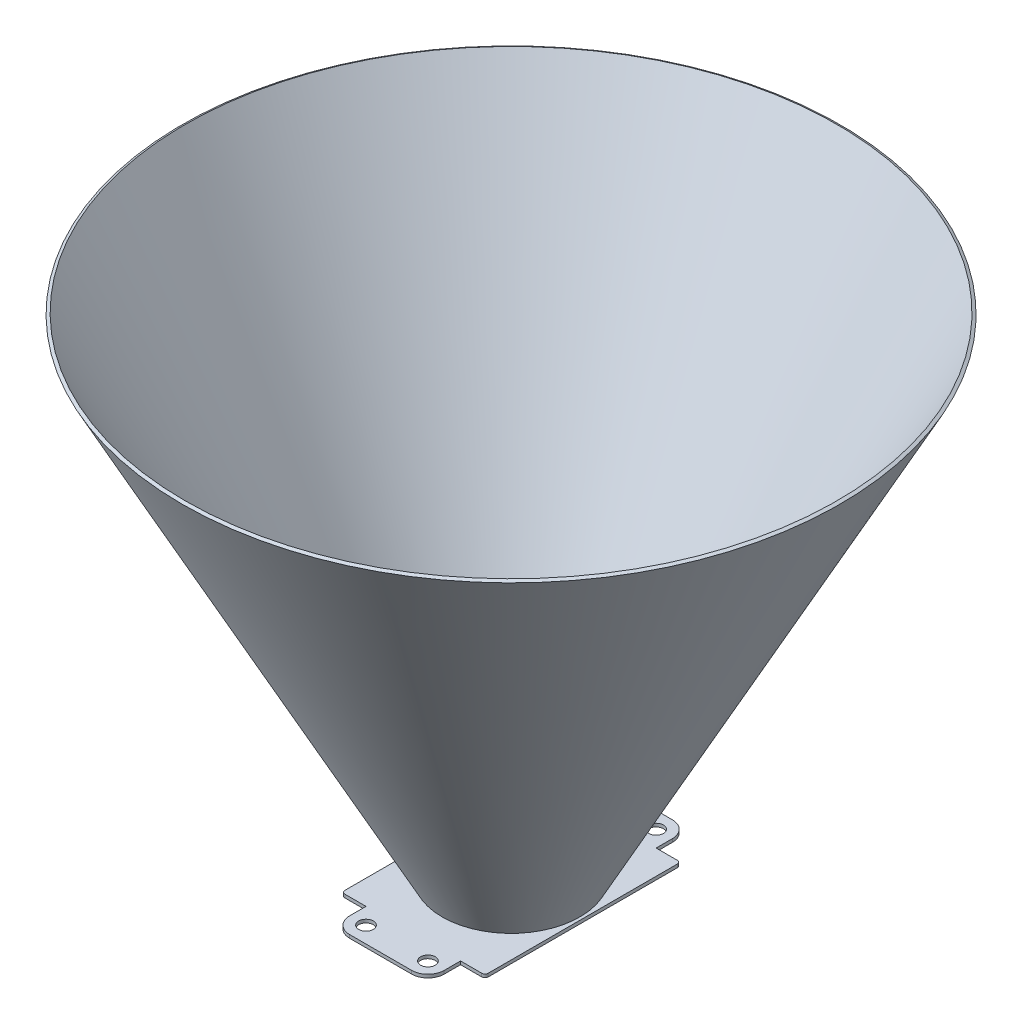
ISO-10303-21;
HEADER;
FILE_DESCRIPTION(('STEP AP214'),'2;1');
FILE_NAME('part.step','',(''),(''),'','','');
FILE_SCHEMA(('AUTOMOTIVE_DESIGN { 1 0 10303 214 1 1 1 1 }'));
ENDSEC;
DATA;
#1=APPLICATION_CONTEXT('core data for automotive mechanical design processes');
#2=APPLICATION_PROTOCOL_DEFINITION('international standard','automotive_design',2000,#1);
#3=PRODUCT_CONTEXT('',#1,'mechanical');
#4=PRODUCT('Part','Part','',(#3));
#5=PRODUCT_RELATED_PRODUCT_CATEGORY('part','',(#4));
#6=PRODUCT_DEFINITION_FORMATION('','',#4);
#7=PRODUCT_DEFINITION_CONTEXT('part definition',#1,'design');
#8=PRODUCT_DEFINITION('design','',#6,#7);
#9=PRODUCT_DEFINITION_SHAPE('','',#8);
#10=(LENGTH_UNIT() NAMED_UNIT(*) SI_UNIT(.MILLI.,.METRE.));
#11=(NAMED_UNIT(*) PLANE_ANGLE_UNIT() SI_UNIT($,.RADIAN.));
#12=(NAMED_UNIT(*) SI_UNIT($,.STERADIAN.) SOLID_ANGLE_UNIT());
#13=UNCERTAINTY_MEASURE_WITH_UNIT(LENGTH_MEASURE(1.E-05),#10,'distance_accuracy_value','');
#14=(GEOMETRIC_REPRESENTATION_CONTEXT(3) GLOBAL_UNCERTAINTY_ASSIGNED_CONTEXT((#13)) GLOBAL_UNIT_ASSIGNED_CONTEXT((#10,
#11,#12)) REPRESENTATION_CONTEXT('',''));
#15=CARTESIAN_POINT('',(0.,0.,0.));
#16=DIRECTION('',(0.,0.,1.));
#17=DIRECTION('',(1.,0.,0.));
#18=AXIS2_PLACEMENT_3D('',#15,#16,#17);
#19=CARTESIAN_POINT('',(-44.,2.,-60.));
#20=DIRECTION('',(0.,0.,1.));
#21=DIRECTION('',(1.,0.,0.));
#22=AXIS2_PLACEMENT_3D('',#19,#20,#21);
#23=PLANE('',#22);
#24=DIRECTION('',(-1.,0.,0.));
#25=VECTOR('',#24,1.);
#26=CARTESIAN_POINT('',(-44.,2.,-60.));
#27=LINE('',#26,#25);
#28=CARTESIAN_POINT('',(42.,2.,-60.));
#29=VERTEX_POINT('',#28);
#30=CARTESIAN_POINT('',(29.,2.,-60.));
#31=VERTEX_POINT('',#30);
#32=EDGE_CURVE('E227',#29,#31,#27,.T.);
#33=ORIENTED_EDGE('',*,*,#32,.F.);
#34=DIRECTION('',(0.,-1.,0.));
#35=VECTOR('',#34,1.);
#36=CARTESIAN_POINT('',(42.,2.,-60.));
#37=LINE('',#36,#35);
#38=CARTESIAN_POINT('',(42.,0.,-60.));
#39=VERTEX_POINT('',#38);
#40=EDGE_CURVE('E342',#29,#39,#37,.T.);
#41=ORIENTED_EDGE('',*,*,#40,.T.);
#42=DIRECTION('',(-1.,0.,0.));
#43=VECTOR('',#42,1.);
#44=CARTESIAN_POINT('',(-44.,0.,-60.));
#45=LINE('',#44,#43);
#46=CARTESIAN_POINT('',(29.,0.,-60.));
#47=VERTEX_POINT('',#46);
#48=EDGE_CURVE('E245',#39,#47,#45,.T.);
#49=ORIENTED_EDGE('',*,*,#48,.T.);
#50=DIRECTION('',(0.,-1.,0.));
#51=VECTOR('',#50,1.);
#52=CARTESIAN_POINT('',(29.,2.,-60.));
#53=LINE('',#52,#51);
#54=EDGE_CURVE('E212',#31,#47,#53,.T.);
#55=ORIENTED_EDGE('',*,*,#54,.F.);
#56=EDGE_LOOP('',(#33,#41,#49,#55));
#57=FACE_BOUND('',#56,.T.);
#58=ADVANCED_FACE('F64',(#57),#23,.F.);
#59=CARTESIAN_POINT('',(-44.,2.,60.));
#60=DIRECTION('',(0.,0.,-1.));
#61=DIRECTION('',(-1.,0.,0.));
#62=AXIS2_PLACEMENT_3D('',#59,#60,#61);
#63=PLANE('',#62);
#64=DIRECTION('',(1.,0.,0.));
#65=VECTOR('',#64,1.);
#66=CARTESIAN_POINT('',(-44.,2.,60.));
#67=LINE('',#66,#65);
#68=CARTESIAN_POINT('',(-42.,2.,60.));
#69=VERTEX_POINT('',#68);
#70=CARTESIAN_POINT('',(-29.,2.,60.));
#71=VERTEX_POINT('',#70);
#72=EDGE_CURVE('E237',#69,#71,#67,.T.);
#73=ORIENTED_EDGE('',*,*,#72,.F.);
#74=DIRECTION('',(0.,-1.,0.));
#75=VECTOR('',#74,1.);
#76=CARTESIAN_POINT('',(-42.,2.,60.));
#77=LINE('',#76,#75);
#78=CARTESIAN_POINT('',(-42.,0.,60.));
#79=VERTEX_POINT('',#78);
#80=EDGE_CURVE('E382',#69,#79,#77,.T.);
#81=ORIENTED_EDGE('',*,*,#80,.T.);
#82=DIRECTION('',(1.,0.,0.));
#83=VECTOR('',#82,1.);
#84=CARTESIAN_POINT('',(-44.,0.,60.));
#85=LINE('',#84,#83);
#86=CARTESIAN_POINT('',(-29.,0.,60.));
#87=VERTEX_POINT('',#86);
#88=EDGE_CURVE('E231',#79,#87,#85,.T.);
#89=ORIENTED_EDGE('',*,*,#88,.T.);
#90=DIRECTION('',(0.,-1.,0.));
#91=VECTOR('',#90,1.);
#92=CARTESIAN_POINT('',(-29.,2.,60.));
#93=LINE('',#92,#91);
#94=EDGE_CURVE('E385',#71,#87,#93,.T.);
#95=ORIENTED_EDGE('',*,*,#94,.F.);
#96=EDGE_LOOP('',(#73,#81,#89,#95));
#97=FACE_BOUND('',#96,.T.);
#98=ADVANCED_FACE('F292',(#97),#63,.F.);
#99=CARTESIAN_POINT('',(44.,2.,-60.));
#100=DIRECTION('',(-1.,0.,0.));
#101=DIRECTION('',(0.,0.,1.));
#102=AXIS2_PLACEMENT_3D('',#99,#100,#101);
#103=PLANE('',#102);
#104=DIRECTION('',(0.,0.,-1.));
#105=VECTOR('',#104,1.);
#106=CARTESIAN_POINT('',(44.,0.,-60.));
#107=LINE('',#106,#105);
#108=CARTESIAN_POINT('',(44.,0.,58.));
#109=VERTEX_POINT('',#108);
#110=CARTESIAN_POINT('',(44.,0.,-58.));
#111=VERTEX_POINT('',#110);
#112=EDGE_CURVE('E240',#109,#111,#107,.T.);
#113=ORIENTED_EDGE('',*,*,#112,.T.);
#114=DIRECTION('',(0.,-1.,0.));
#115=VECTOR('',#114,1.);
#116=CARTESIAN_POINT('',(44.,2.,-58.));
#117=LINE('',#116,#115);
#118=CARTESIAN_POINT('',(44.,2.,-58.));
#119=VERTEX_POINT('',#118);
#120=EDGE_CURVE('E72',#111,#119,#117,.F.);
#121=ORIENTED_EDGE('',*,*,#120,.T.);
#122=DIRECTION('',(0.,0.,-1.));
#123=VECTOR('',#122,1.);
#124=CARTESIAN_POINT('',(44.,2.,-60.));
#125=LINE('',#124,#123);
#126=CARTESIAN_POINT('',(44.,2.,58.));
#127=VERTEX_POINT('',#126);
#128=EDGE_CURVE('E228',#127,#119,#125,.T.);
#129=ORIENTED_EDGE('',*,*,#128,.F.);
#130=DIRECTION('',(0.,-1.,0.));
#131=VECTOR('',#130,1.);
#132=CARTESIAN_POINT('',(44.,2.,58.));
#133=LINE('',#132,#131);
#134=EDGE_CURVE('E349',#127,#109,#133,.T.);
#135=ORIENTED_EDGE('',*,*,#134,.T.);
#136=EDGE_LOOP('',(#113,#121,#129,#135));
#137=FACE_BOUND('',#136,.T.);
#138=ADVANCED_FACE('F298',(#137),#103,.F.);
#139=CARTESIAN_POINT('',(-29.,0.,-60.));
#140=VERTEX_POINT('',#139);
#141=CARTESIAN_POINT('',(-42.,0.,-60.));
#142=VERTEX_POINT('',#141);
#143=EDGE_CURVE('E243',#140,#142,#45,.T.);
#144=ORIENTED_EDGE('',*,*,#143,.T.);
#145=DIRECTION('',(0.,-1.,0.));
#146=VECTOR('',#145,1.);
#147=CARTESIAN_POINT('',(-42.,2.,-60.));
#148=LINE('',#147,#146);
#149=CARTESIAN_POINT('',(-42.,2.,-60.));
#150=VERTEX_POINT('',#149);
#151=EDGE_CURVE('E79',#142,#150,#148,.F.);
#152=ORIENTED_EDGE('',*,*,#151,.T.);
#153=CARTESIAN_POINT('',(-29.,2.,-60.));
#154=VERTEX_POINT('',#153);
#155=EDGE_CURVE('E218',#154,#150,#27,.T.);
#156=ORIENTED_EDGE('',*,*,#155,.F.);
#157=DIRECTION('',(0.,-1.,0.));
#158=VECTOR('',#157,1.);
#159=CARTESIAN_POINT('',(-29.,2.,-60.));
#160=LINE('',#159,#158);
#161=EDGE_CURVE('E203',#154,#140,#160,.T.);
#162=ORIENTED_EDGE('',*,*,#161,.T.);
#163=EDGE_LOOP('',(#144,#152,#156,#162));
#164=FACE_BOUND('',#163,.T.);
#165=ADVANCED_FACE('F226',(#164),#23,.F.);
#166=CARTESIAN_POINT('',(-44.,2.,-60.));
#167=DIRECTION('',(1.,0.,0.));
#168=DIRECTION('',(0.,0.,-1.));
#169=AXIS2_PLACEMENT_3D('',#166,#167,#168);
#170=PLANE('',#169);
#171=DIRECTION('',(0.,0.,1.));
#172=VECTOR('',#171,1.);
#173=CARTESIAN_POINT('',(-44.,0.,-60.));
#174=LINE('',#173,#172);
#175=CARTESIAN_POINT('',(-44.,0.,-58.));
#176=VERTEX_POINT('',#175);
#177=CARTESIAN_POINT('',(-44.,0.,58.));
#178=VERTEX_POINT('',#177);
#179=EDGE_CURVE('E247',#176,#178,#174,.T.);
#180=ORIENTED_EDGE('',*,*,#179,.T.);
#181=DIRECTION('',(0.,-1.,0.));
#182=VECTOR('',#181,1.);
#183=CARTESIAN_POINT('',(-44.,2.,58.));
#184=LINE('',#183,#182);
#185=CARTESIAN_POINT('',(-44.,2.,58.));
#186=VERTEX_POINT('',#185);
#187=EDGE_CURVE('E365',#178,#186,#184,.F.);
#188=ORIENTED_EDGE('',*,*,#187,.T.);
#189=DIRECTION('',(0.,0.,1.));
#190=VECTOR('',#189,1.);
#191=CARTESIAN_POINT('',(-44.,2.,-60.));
#192=LINE('',#191,#190);
#193=CARTESIAN_POINT('',(-44.,2.,-58.));
#194=VERTEX_POINT('',#193);
#195=EDGE_CURVE('E230',#194,#186,#192,.T.);
#196=ORIENTED_EDGE('',*,*,#195,.F.);
#197=DIRECTION('',(0.,-1.,0.));
#198=VECTOR('',#197,1.);
#199=CARTESIAN_POINT('',(-44.,2.,-58.));
#200=LINE('',#199,#198);
#201=EDGE_CURVE('E369',#194,#176,#200,.T.);
#202=ORIENTED_EDGE('',*,*,#201,.T.);
#203=EDGE_LOOP('',(#180,#188,#196,#202));
#204=FACE_BOUND('',#203,.T.);
#205=ADVANCED_FACE('F290',(#204),#170,.F.);
#206=CARTESIAN_POINT('',(29.,0.,60.));
#207=VERTEX_POINT('',#206);
#208=CARTESIAN_POINT('',(42.,0.,60.));
#209=VERTEX_POINT('',#208);
#210=EDGE_CURVE('E250',#207,#209,#85,.T.);
#211=ORIENTED_EDGE('',*,*,#210,.T.);
#212=DIRECTION('',(0.,-1.,0.));
#213=VECTOR('',#212,1.);
#214=CARTESIAN_POINT('',(42.,2.,60.));
#215=LINE('',#214,#213);
#216=CARTESIAN_POINT('',(42.,2.,60.));
#217=VERTEX_POINT('',#216);
#218=EDGE_CURVE('E12',#209,#217,#215,.F.);
#219=ORIENTED_EDGE('',*,*,#218,.T.);
#220=CARTESIAN_POINT('',(29.,2.,60.));
#221=VERTEX_POINT('',#220);
#222=EDGE_CURVE('E236',#221,#217,#67,.T.);
#223=ORIENTED_EDGE('',*,*,#222,.F.);
#224=DIRECTION('',(0.,-1.,0.));
#225=VECTOR('',#224,1.);
#226=CARTESIAN_POINT('',(29.,2.,60.));
#227=LINE('',#226,#225);
#228=EDGE_CURVE('E415',#221,#207,#227,.T.);
#229=ORIENTED_EDGE('',*,*,#228,.T.);
#230=EDGE_LOOP('',(#211,#219,#223,#229));
#231=FACE_BOUND('',#230,.T.);
#232=ADVANCED_FACE('F283',(#231),#63,.F.);
#233=CARTESIAN_POINT('',(0.,2.,0.));
#234=DIRECTION('',(0.,1.,0.));
#235=DIRECTION('',(0.,0.,1.));
#236=AXIS2_PLACEMENT_3D('',#233,#234,#235);
#237=PLANE('',#236);
#238=CARTESIAN_POINT('',(0.,2.,0.));
#239=DIRECTION('',(0.,1.,0.));
#240=DIRECTION('',(0.,0.,1.));
#241=AXIS2_PLACEMENT_3D('',#238,#239,#240);
#242=CIRCLE('',#241,42.2666666666667);
#243=CARTESIAN_POINT('',(0.,2.,42.2666666666667));
#244=VERTEX_POINT('',#243);
#245=EDGE_CURVE('E239',#244,#244,#242,.T.);
#246=ORIENTED_EDGE('',*,*,#245,.F.);
#247=EDGE_LOOP('',(#246));
#248=FACE_BOUND('',#247,.T.);
#249=ORIENTED_EDGE('',*,*,#195,.T.);
#250=CARTESIAN_POINT('',(-42.,2.,58.));
#251=DIRECTION('',(0.,1.,0.));
#252=DIRECTION('',(0.,0.,1.));
#253=AXIS2_PLACEMENT_3D('',#250,#251,#252);
#254=CIRCLE('',#253,2.);
#255=EDGE_CURVE('E353',#186,#69,#254,.T.);
#256=ORIENTED_EDGE('',*,*,#255,.T.);
#257=ORIENTED_EDGE('',*,*,#72,.T.);
#258=DIRECTION('',(0.,0.,-1.));
#259=VECTOR('',#258,1.);
#260=CARTESIAN_POINT('',(-29.,2.,80.));
#261=LINE('',#260,#259);
#262=CARTESIAN_POINT('',(-29.,2.,70.));
#263=VERTEX_POINT('',#262);
#264=EDGE_CURVE('E414',#263,#71,#261,.T.);
#265=ORIENTED_EDGE('',*,*,#264,.F.);
#266=CARTESIAN_POINT('',(-19.,2.,70.));
#267=DIRECTION('',(0.,1.,0.));
#268=DIRECTION('',(0.,0.,1.));
#269=AXIS2_PLACEMENT_3D('',#266,#267,#268);
#270=CIRCLE('',#269,10.);
#271=CARTESIAN_POINT('',(-19.,2.,80.));
#272=VERTEX_POINT('',#271);
#273=EDGE_CURVE('E781',#263,#272,#270,.T.);
#274=ORIENTED_EDGE('',*,*,#273,.T.);
#275=DIRECTION('',(-1.,0.,0.));
#276=VECTOR('',#275,1.);
#277=CARTESIAN_POINT('',(29.,2.,80.));
#278=LINE('',#277,#276);
#279=CARTESIAN_POINT('',(19.,2.,80.));
#280=VERTEX_POINT('',#279);
#281=EDGE_CURVE('E416',#280,#272,#278,.T.);
#282=ORIENTED_EDGE('',*,*,#281,.F.);
#283=CARTESIAN_POINT('',(19.,2.,70.));
#284=DIRECTION('',(0.,1.,0.));
#285=DIRECTION('',(0.,0.,1.));
#286=AXIS2_PLACEMENT_3D('',#283,#284,#285);
#287=CIRCLE('',#286,10.);
#288=CARTESIAN_POINT('',(29.,2.,70.));
#289=VERTEX_POINT('',#288);
#290=EDGE_CURVE('E766',#280,#289,#287,.T.);
#291=ORIENTED_EDGE('',*,*,#290,.T.);
#292=DIRECTION('',(0.,0.,1.));
#293=VECTOR('',#292,1.);
#294=CARTESIAN_POINT('',(29.,2.,60.));
#295=LINE('',#294,#293);
#296=EDGE_CURVE('E422',#221,#289,#295,.T.);
#297=ORIENTED_EDGE('',*,*,#296,.F.);
#298=ORIENTED_EDGE('',*,*,#222,.T.);
#299=CARTESIAN_POINT('',(42.,2.,58.));
#300=DIRECTION('',(0.,1.,0.));
#301=DIRECTION('',(0.,0.,1.));
#302=AXIS2_PLACEMENT_3D('',#299,#300,#301);
#303=CIRCLE('',#302,2.);
#304=EDGE_CURVE('E361',#217,#127,#303,.T.);
#305=ORIENTED_EDGE('',*,*,#304,.T.);
#306=ORIENTED_EDGE('',*,*,#128,.T.);
#307=CARTESIAN_POINT('',(42.,2.,-58.));
#308=DIRECTION('',(0.,1.,0.));
#309=DIRECTION('',(0.,0.,1.));
#310=AXIS2_PLACEMENT_3D('',#307,#308,#309);
#311=CIRCLE('',#310,2.);
#312=EDGE_CURVE('E87',#119,#29,#311,.T.);
#313=ORIENTED_EDGE('',*,*,#312,.T.);
#314=ORIENTED_EDGE('',*,*,#32,.T.);
#315=DIRECTION('',(0.,0.,1.));
#316=VECTOR('',#315,1.);
#317=CARTESIAN_POINT('',(29.,2.,-60.));
#318=LINE('',#317,#316);
#319=CARTESIAN_POINT('',(29.,2.,-70.));
#320=VERTEX_POINT('',#319);
#321=EDGE_CURVE('E213',#320,#31,#318,.T.);
#322=ORIENTED_EDGE('',*,*,#321,.F.);
#323=CARTESIAN_POINT('',(19.,2.,-70.));
#324=DIRECTION('',(0.,1.,0.));
#325=DIRECTION('',(0.,0.,1.));
#326=AXIS2_PLACEMENT_3D('',#323,#324,#325);
#327=CIRCLE('',#326,10.);
#328=CARTESIAN_POINT('',(19.,2.,-80.));
#329=VERTEX_POINT('',#328);
#330=EDGE_CURVE('E778',#320,#329,#327,.T.);
#331=ORIENTED_EDGE('',*,*,#330,.T.);
#332=DIRECTION('',(1.,0.,0.));
#333=VECTOR('',#332,1.);
#334=CARTESIAN_POINT('',(29.,2.,-80.));
#335=LINE('',#334,#333);
#336=CARTESIAN_POINT('',(-19.,2.,-80.));
#337=VERTEX_POINT('',#336);
#338=EDGE_CURVE('E223',#337,#329,#335,.T.);
#339=ORIENTED_EDGE('',*,*,#338,.F.);
#340=CARTESIAN_POINT('',(-19.,2.,-70.));
#341=DIRECTION('',(0.,1.,0.));
#342=DIRECTION('',(0.,0.,1.));
#343=AXIS2_PLACEMENT_3D('',#340,#341,#342);
#344=CIRCLE('',#343,10.);
#345=CARTESIAN_POINT('',(-29.,2.,-70.));
#346=VERTEX_POINT('',#345);
#347=EDGE_CURVE('E222',#337,#346,#344,.T.);
#348=ORIENTED_EDGE('',*,*,#347,.T.);
#349=DIRECTION('',(0.,0.,-1.));
#350=VECTOR('',#349,1.);
#351=CARTESIAN_POINT('',(-29.,2.,-80.));
#352=LINE('',#351,#350);
#353=EDGE_CURVE('E207',#154,#346,#352,.T.);
#354=ORIENTED_EDGE('',*,*,#353,.F.);
#355=ORIENTED_EDGE('',*,*,#155,.T.);
#356=CARTESIAN_POINT('',(-42.,2.,-58.));
#357=DIRECTION('',(0.,1.,0.));
#358=DIRECTION('',(0.,0.,1.));
#359=AXIS2_PLACEMENT_3D('',#356,#357,#358);
#360=CIRCLE('',#359,2.);
#361=EDGE_CURVE('E367',#150,#194,#360,.T.);
#362=ORIENTED_EDGE('',*,*,#361,.T.);
#363=EDGE_LOOP('',(#249,#256,#257,#265,#274,#282,#291,#297,#298,#305,#306,#313,#314,#322,#331,
#339,#348,#354,#355,#362));
#364=FACE_BOUND('',#363,.T.);
#365=CARTESIAN_POINT('',(-19.,2.,70.));
#366=DIRECTION('',(0.,-1.,0.));
#367=DIRECTION('',(0.,0.,1.));
#368=AXIS2_PLACEMENT_3D('',#365,#366,#367);
#369=CIRCLE('',#368,4.50000000000001);
#370=CARTESIAN_POINT('',(-19.,2.,74.5));
#371=VERTEX_POINT('',#370);
#372=EDGE_CURVE('E741',#371,#371,#369,.T.);
#373=ORIENTED_EDGE('',*,*,#372,.T.);
#374=EDGE_LOOP('',(#373));
#375=FACE_BOUND('',#374,.T.);
#376=CARTESIAN_POINT('',(19.,2.,70.));
#377=DIRECTION('',(0.,-1.,0.));
#378=DIRECTION('',(0.,0.,-1.));
#379=AXIS2_PLACEMENT_3D('',#376,#377,#378);
#380=CIRCLE('',#379,4.50000000000001);
#381=CARTESIAN_POINT('',(19.,2.,65.5));
#382=VERTEX_POINT('',#381);
#383=EDGE_CURVE('E411',#382,#382,#380,.T.);
#384=ORIENTED_EDGE('',*,*,#383,.T.);
#385=EDGE_LOOP('',(#384));
#386=FACE_BOUND('',#385,.T.);
#387=CARTESIAN_POINT('',(19.,2.,-70.));
#388=DIRECTION('',(0.,-1.,0.));
#389=DIRECTION('',(0.,0.,1.));
#390=AXIS2_PLACEMENT_3D('',#387,#388,#389);
#391=CIRCLE('',#390,4.50000000000001);
#392=CARTESIAN_POINT('',(19.,2.,-65.5));
#393=VERTEX_POINT('',#392);
#394=EDGE_CURVE('E716',#393,#393,#391,.T.);
#395=ORIENTED_EDGE('',*,*,#394,.T.);
#396=EDGE_LOOP('',(#395));
#397=FACE_BOUND('',#396,.T.);
#398=CARTESIAN_POINT('',(-19.,2.,-70.));
#399=DIRECTION('',(0.,-1.,0.));
#400=DIRECTION('',(0.,0.,-1.));
#401=AXIS2_PLACEMENT_3D('',#398,#399,#400);
#402=CIRCLE('',#401,4.50000000000001);
#403=CARTESIAN_POINT('',(-19.,2.,-74.5));
#404=VERTEX_POINT('',#403);
#405=EDGE_CURVE('E725',#404,#404,#402,.T.);
#406=ORIENTED_EDGE('',*,*,#405,.T.);
#407=EDGE_LOOP('',(#406));
#408=FACE_BOUND('',#407,.T.);
#409=ADVANCED_FACE('F216',(#248,#364,#375,#386,#397,#408),#237,.T.);
#410=CARTESIAN_POINT('',(0.,0.,0.));
#411=DIRECTION('',(0.,1.,0.));
#412=DIRECTION('',(0.,0.,1.));
#413=AXIS2_PLACEMENT_3D('',#410,#411,#412);
#414=PLANE('',#413);
#415=CARTESIAN_POINT('',(0.,0.,0.));
#416=DIRECTION('',(0.,1.,0.));
#417=DIRECTION('',(0.,0.,1.));
#418=AXIS2_PLACEMENT_3D('',#415,#416,#417);
#419=CIRCLE('',#418,40.);
#420=CARTESIAN_POINT('',(0.,0.,40.));
#421=VERTEX_POINT('',#420);
#422=EDGE_CURVE('E244',#421,#421,#419,.T.);
#423=ORIENTED_EDGE('',*,*,#422,.T.);
#424=EDGE_LOOP('',(#423));
#425=FACE_BOUND('',#424,.T.);
#426=ORIENTED_EDGE('',*,*,#88,.F.);
#427=CARTESIAN_POINT('',(-42.,0.,58.));
#428=DIRECTION('',(0.,1.,0.));
#429=DIRECTION('',(0.,0.,1.));
#430=AXIS2_PLACEMENT_3D('',#427,#428,#429);
#431=CIRCLE('',#430,2.);
#432=EDGE_CURVE('E386',#79,#178,#431,.F.);
#433=ORIENTED_EDGE('',*,*,#432,.T.);
#434=ORIENTED_EDGE('',*,*,#179,.F.);
#435=CARTESIAN_POINT('',(-42.,0.,-58.));
#436=DIRECTION('',(0.,1.,0.));
#437=DIRECTION('',(0.,0.,1.));
#438=AXIS2_PLACEMENT_3D('',#435,#436,#437);
#439=CIRCLE('',#438,2.);
#440=EDGE_CURVE('E396',#176,#142,#439,.F.);
#441=ORIENTED_EDGE('',*,*,#440,.T.);
#442=ORIENTED_EDGE('',*,*,#143,.F.);
#443=DIRECTION('',(0.,0.,-1.));
#444=VECTOR('',#443,1.);
#445=CARTESIAN_POINT('',(-29.,0.,-80.));
#446=LINE('',#445,#444);
#447=CARTESIAN_POINT('',(-29.,0.,-70.));
#448=VERTEX_POINT('',#447);
#449=EDGE_CURVE('E210',#140,#448,#446,.T.);
#450=ORIENTED_EDGE('',*,*,#449,.T.);
#451=CARTESIAN_POINT('',(-19.,0.,-70.));
#452=DIRECTION('',(0.,1.,0.));
#453=DIRECTION('',(0.,0.,1.));
#454=AXIS2_PLACEMENT_3D('',#451,#452,#453);
#455=CIRCLE('',#454,10.);
#456=CARTESIAN_POINT('',(-19.,0.,-80.));
#457=VERTEX_POINT('',#456);
#458=EDGE_CURVE('E767',#448,#457,#455,.F.);
#459=ORIENTED_EDGE('',*,*,#458,.T.);
#460=DIRECTION('',(1.,0.,0.));
#461=VECTOR('',#460,1.);
#462=CARTESIAN_POINT('',(29.,0.,-80.));
#463=LINE('',#462,#461);
#464=CARTESIAN_POINT('',(19.,0.,-80.));
#465=VERTEX_POINT('',#464);
#466=EDGE_CURVE('E734',#457,#465,#463,.T.);
#467=ORIENTED_EDGE('',*,*,#466,.T.);
#468=CARTESIAN_POINT('',(19.,0.,-70.));
#469=DIRECTION('',(0.,1.,0.));
#470=DIRECTION('',(0.,0.,1.));
#471=AXIS2_PLACEMENT_3D('',#468,#469,#470);
#472=CIRCLE('',#471,10.);
#473=CARTESIAN_POINT('',(29.,0.,-70.));
#474=VERTEX_POINT('',#473);
#475=EDGE_CURVE('E771',#465,#474,#472,.F.);
#476=ORIENTED_EDGE('',*,*,#475,.T.);
#477=DIRECTION('',(0.,0.,1.));
#478=VECTOR('',#477,1.);
#479=CARTESIAN_POINT('',(29.,0.,-60.));
#480=LINE('',#479,#478);
#481=EDGE_CURVE('E224',#474,#47,#480,.T.);
#482=ORIENTED_EDGE('',*,*,#481,.T.);
#483=ORIENTED_EDGE('',*,*,#48,.F.);
#484=CARTESIAN_POINT('',(42.,0.,-58.));
#485=DIRECTION('',(0.,1.,0.));
#486=DIRECTION('',(0.,0.,1.));
#487=AXIS2_PLACEMENT_3D('',#484,#485,#486);
#488=CIRCLE('',#487,2.);
#489=EDGE_CURVE('E348',#39,#111,#488,.F.);
#490=ORIENTED_EDGE('',*,*,#489,.T.);
#491=ORIENTED_EDGE('',*,*,#112,.F.);
#492=CARTESIAN_POINT('',(42.,0.,58.));
#493=DIRECTION('',(0.,1.,0.));
#494=DIRECTION('',(0.,0.,1.));
#495=AXIS2_PLACEMENT_3D('',#492,#493,#494);
#496=CIRCLE('',#495,2.);
#497=EDGE_CURVE('E387',#109,#209,#496,.F.);
#498=ORIENTED_EDGE('',*,*,#497,.T.);
#499=ORIENTED_EDGE('',*,*,#210,.F.);
#500=DIRECTION('',(0.,0.,1.));
#501=VECTOR('',#500,1.);
#502=CARTESIAN_POINT('',(29.,0.,60.));
#503=LINE('',#502,#501);
#504=CARTESIAN_POINT('',(29.,0.,70.));
#505=VERTEX_POINT('',#504);
#506=EDGE_CURVE('E410',#207,#505,#503,.T.);
#507=ORIENTED_EDGE('',*,*,#506,.T.);
#508=CARTESIAN_POINT('',(19.,0.,70.));
#509=DIRECTION('',(0.,1.,0.));
#510=DIRECTION('',(0.,0.,1.));
#511=AXIS2_PLACEMENT_3D('',#508,#509,#510);
#512=CIRCLE('',#511,10.);
#513=CARTESIAN_POINT('',(19.,0.,80.));
#514=VERTEX_POINT('',#513);
#515=EDGE_CURVE('E757',#505,#514,#512,.F.);
#516=ORIENTED_EDGE('',*,*,#515,.T.);
#517=DIRECTION('',(-1.,0.,0.));
#518=VECTOR('',#517,1.);
#519=CARTESIAN_POINT('',(29.,0.,80.));
#520=LINE('',#519,#518);
#521=CARTESIAN_POINT('',(-19.,0.,80.));
#522=VERTEX_POINT('',#521);
#523=EDGE_CURVE('E752',#514,#522,#520,.T.);
#524=ORIENTED_EDGE('',*,*,#523,.T.);
#525=CARTESIAN_POINT('',(-19.,0.,70.));
#526=DIRECTION('',(0.,1.,0.));
#527=DIRECTION('',(0.,0.,1.));
#528=AXIS2_PLACEMENT_3D('',#525,#526,#527);
#529=CIRCLE('',#528,10.);
#530=CARTESIAN_POINT('',(-29.,0.,70.));
#531=VERTEX_POINT('',#530);
#532=EDGE_CURVE('E407',#522,#531,#529,.F.);
#533=ORIENTED_EDGE('',*,*,#532,.T.);
#534=DIRECTION('',(0.,0.,-1.));
#535=VECTOR('',#534,1.);
#536=CARTESIAN_POINT('',(-29.,0.,80.));
#537=LINE('',#536,#535);
#538=EDGE_CURVE('E405',#531,#87,#537,.T.);
#539=ORIENTED_EDGE('',*,*,#538,.T.);
#540=EDGE_LOOP('',(#426,#433,#434,#441,#442,#450,#459,#467,#476,#482,#483,#490,#491,#498,#499,
#507,#516,#524,#533,#539));
#541=FACE_BOUND('',#540,.T.);
#542=CARTESIAN_POINT('',(-19.,0.,70.));
#543=DIRECTION('',(0.,-1.,0.));
#544=DIRECTION('',(0.,0.,1.));
#545=AXIS2_PLACEMENT_3D('',#542,#543,#544);
#546=CIRCLE('',#545,4.50000000000001);
#547=CARTESIAN_POINT('',(-19.,0.,74.5));
#548=VERTEX_POINT('',#547);
#549=EDGE_CURVE('E739',#548,#548,#546,.T.);
#550=ORIENTED_EDGE('',*,*,#549,.F.);
#551=EDGE_LOOP('',(#550));
#552=FACE_BOUND('',#551,.T.);
#553=CARTESIAN_POINT('',(19.,0.,70.));
#554=DIRECTION('',(0.,-1.,0.));
#555=DIRECTION('',(0.,0.,-1.));
#556=AXIS2_PLACEMENT_3D('',#553,#554,#555);
#557=CIRCLE('',#556,4.50000000000001);
#558=CARTESIAN_POINT('',(19.,0.,65.5));
#559=VERTEX_POINT('',#558);
#560=EDGE_CURVE('E744',#559,#559,#557,.T.);
#561=ORIENTED_EDGE('',*,*,#560,.F.);
#562=EDGE_LOOP('',(#561));
#563=FACE_BOUND('',#562,.T.);
#564=CARTESIAN_POINT('',(19.,0.,-70.));
#565=DIRECTION('',(0.,-1.,0.));
#566=DIRECTION('',(0.,0.,1.));
#567=AXIS2_PLACEMENT_3D('',#564,#565,#566);
#568=CIRCLE('',#567,4.50000000000001);
#569=CARTESIAN_POINT('',(19.,0.,-65.5));
#570=VERTEX_POINT('',#569);
#571=EDGE_CURVE('E719',#570,#570,#568,.T.);
#572=ORIENTED_EDGE('',*,*,#571,.F.);
#573=EDGE_LOOP('',(#572));
#574=FACE_BOUND('',#573,.T.);
#575=CARTESIAN_POINT('',(-19.,0.,-70.));
#576=DIRECTION('',(0.,-1.,0.));
#577=DIRECTION('',(0.,0.,-1.));
#578=AXIS2_PLACEMENT_3D('',#575,#576,#577);
#579=CIRCLE('',#578,4.50000000000001);
#580=CARTESIAN_POINT('',(-19.,0.,-74.5));
#581=VERTEX_POINT('',#580);
#582=EDGE_CURVE('E722',#581,#581,#579,.T.);
#583=ORIENTED_EDGE('',*,*,#582,.F.);
#584=EDGE_LOOP('',(#583));
#585=FACE_BOUND('',#584,.T.);
#586=ADVANCED_FACE('F277',(#425,#541,#552,#563,#574,#585),#414,.F.);
#587=CARTESIAN_POINT('',(0.,0.,0.));
#588=DIRECTION('',(0.,1.,0.));
#589=DIRECTION('',(0.,0.,1.));
#590=AXIS2_PLACEMENT_3D('',#587,#588,#589);
#591=CYLINDRICAL_SURFACE('',#590,40.);
#592=ORIENTED_EDGE('',*,*,#422,.F.);
#593=EDGE_LOOP('',(#592));
#594=FACE_BOUND('',#593,.T.);
#595=CARTESIAN_POINT('',(0.,2.,0.));
#596=DIRECTION('',(0.,1.,0.));
#597=DIRECTION('',(0.,0.,1.));
#598=AXIS2_PLACEMENT_3D('',#595,#596,#597);
#599=CIRCLE('',#598,40.);
#600=CARTESIAN_POINT('',(0.,2.,40.));
#601=VERTEX_POINT('',#600);
#602=EDGE_CURVE('E259',#601,#601,#599,.T.);
#603=ORIENTED_EDGE('',*,*,#602,.T.);
#604=EDGE_LOOP('',(#603));
#605=FACE_BOUND('',#604,.T.);
#606=ADVANCED_FACE('F266',(#594,#605),#591,.F.);
#607=CARTESIAN_POINT('',(0.,302.,0.));
#608=DIRECTION('',(0.,-1.,0.));
#609=DIRECTION('',(0.,0.,-1.));
#610=AXIS2_PLACEMENT_3D('',#607,#608,#609);
#611=CONICAL_SURFACE('',#610,200.,1.08083900054117);
#612=CARTESIAN_POINT('',(0.,301.058823529412,0.));
#613=DIRECTION('',(0.,1.,0.));
#614=DIRECTION('',(0.56359204964654,0.,-0.826053268001048));
#615=AXIS2_PLACEMENT_3D('',#612,#613,#614);
#616=CIRCLE('',#615,201.764705882353);
#617=CARTESIAN_POINT('',(113.712984134567,301.058823529412,-166.668394661388));
#618=VERTEX_POINT('',#617);
#619=EDGE_CURVE('E430',#618,#618,#616,.T.);
#620=ORIENTED_EDGE('',*,*,#619,.T.);
#621=EDGE_LOOP('',(#620));
#622=FACE_BOUND('',#621,.T.);
#623=CARTESIAN_POINT('',(0.,302.,0.));
#624=DIRECTION('',(0.,1.,0.));
#625=DIRECTION('',(0.,0.,1.));
#626=AXIS2_PLACEMENT_3D('',#623,#624,#625);
#627=CIRCLE('',#626,200.);
#628=CARTESIAN_POINT('',(0.,302.,200.));
#629=VERTEX_POINT('',#628);
#630=EDGE_CURVE('E419',#629,#629,#627,.T.);
#631=ORIENTED_EDGE('',*,*,#630,.F.);
#632=EDGE_LOOP('',(#631));
#633=FACE_BOUND('',#632,.T.);
#634=ADVANCED_FACE('F276',(#622,#633),#611,.T.);
#635=CARTESIAN_POINT('',(0.,1.05882352941176,0.));
#636=DIRECTION('',(0.,1.,0.));
#637=DIRECTION('',(0.,0.,1.));
#638=AXIS2_PLACEMENT_3D('',#635,#636,#637);
#639=CONICAL_SURFACE('',#638,41.7647058823529,0.489957326253728);
#640=ORIENTED_EDGE('',*,*,#245,.T.);
#641=EDGE_LOOP('',(#640));
#642=FACE_BOUND('',#641,.T.);
#643=ORIENTED_EDGE('',*,*,#619,.F.);
#644=EDGE_LOOP('',(#643));
#645=FACE_BOUND('',#644,.T.);
#646=ADVANCED_FACE('F436',(#642,#645),#639,.T.);
#647=CARTESIAN_POINT('',(0.,2.,0.));
#648=DIRECTION('',(0.,1.,0.));
#649=DIRECTION('',(0.,0.,1.));
#650=AXIS2_PLACEMENT_3D('',#647,#648,#649);
#651=CONICAL_SURFACE('',#650,40.,0.489957326253728);
#652=CARTESIAN_POINT('',(0.,2.,40.));
#653=CARTESIAN_POINT('',(0.,5.125,41.6666666666667));
#654=CARTESIAN_POINT('',(0.,8.25,43.3333333333333));
#655=CARTESIAN_POINT('',(0.,14.5,46.6666666666667));
#656=CARTESIAN_POINT('',(0.,17.625,48.3333333333333));
#657=CARTESIAN_POINT('',(0.,23.875,51.6666666666667));
#658=CARTESIAN_POINT('',(0.,27.,53.3333333333333));
#659=CARTESIAN_POINT('',(0.,33.25,56.6666666666667));
#660=CARTESIAN_POINT('',(0.,36.375,58.3333333333333));
#661=CARTESIAN_POINT('',(0.,42.625,61.6666666666667));
#662=CARTESIAN_POINT('',(0.,45.75,63.3333333333333));
#663=CARTESIAN_POINT('',(0.,52.,66.6666666666667));
#664=CARTESIAN_POINT('',(0.,55.125,68.3333333333333));
#665=CARTESIAN_POINT('',(0.,61.375,71.6666666666667));
#666=CARTESIAN_POINT('',(0.,64.5,73.3333333333333));
#667=CARTESIAN_POINT('',(0.,70.75,76.6666666666667));
#668=CARTESIAN_POINT('',(0.,73.875,78.3333333333333));
#669=CARTESIAN_POINT('',(0.,80.125,81.6666666666667));
#670=CARTESIAN_POINT('',(0.,83.25,83.3333333333333));
#671=CARTESIAN_POINT('',(0.,89.5,86.6666666666667));
#672=CARTESIAN_POINT('',(0.,92.625,88.3333333333333));
#673=CARTESIAN_POINT('',(0.,98.875,91.6666666666666));
#674=CARTESIAN_POINT('',(0.,102.,93.3333333333333));
#675=CARTESIAN_POINT('',(0.,108.25,96.6666666666667));
#676=CARTESIAN_POINT('',(0.,111.375,98.3333333333333));
#677=CARTESIAN_POINT('',(0.,117.625,101.666666666667));
#678=CARTESIAN_POINT('',(0.,120.75,103.333333333333));
#679=CARTESIAN_POINT('',(0.,127.,106.666666666667));
#680=CARTESIAN_POINT('',(0.,130.125,108.333333333333));
#681=CARTESIAN_POINT('',(0.,136.375,111.666666666667));
#682=CARTESIAN_POINT('',(0.,139.5,113.333333333333));
#683=CARTESIAN_POINT('',(0.,145.75,116.666666666667));
#684=CARTESIAN_POINT('',(0.,148.875,118.333333333333));
#685=CARTESIAN_POINT('',(0.,155.125,121.666666666667));
#686=CARTESIAN_POINT('',(0.,158.25,123.333333333333));
#687=CARTESIAN_POINT('',(0.,164.5,126.666666666667));
#688=CARTESIAN_POINT('',(0.,167.625,128.333333333333));
#689=CARTESIAN_POINT('',(0.,173.875,131.666666666667));
#690=CARTESIAN_POINT('',(0.,177.,133.333333333333));
#691=CARTESIAN_POINT('',(0.,183.25,136.666666666667));
#692=CARTESIAN_POINT('',(0.,186.375,138.333333333333));
#693=CARTESIAN_POINT('',(0.,192.625,141.666666666667));
#694=CARTESIAN_POINT('',(0.,195.75,143.333333333333));
#695=CARTESIAN_POINT('',(0.,202.,146.666666666667));
#696=CARTESIAN_POINT('',(0.,205.125,148.333333333333));
#697=CARTESIAN_POINT('',(0.,211.375,151.666666666667));
#698=CARTESIAN_POINT('',(0.,214.5,153.333333333333));
#699=CARTESIAN_POINT('',(0.,220.75,156.666666666667));
#700=CARTESIAN_POINT('',(0.,223.875,158.333333333333));
#701=CARTESIAN_POINT('',(0.,230.125,161.666666666667));
#702=CARTESIAN_POINT('',(0.,233.25,163.333333333333));
#703=CARTESIAN_POINT('',(0.,239.5,166.666666666667));
#704=CARTESIAN_POINT('',(0.,242.625,168.333333333333));
#705=CARTESIAN_POINT('',(0.,248.875,171.666666666667));
#706=CARTESIAN_POINT('',(0.,252.,173.333333333333));
#707=CARTESIAN_POINT('',(0.,258.25,176.666666666667));
#708=CARTESIAN_POINT('',(0.,261.375,178.333333333333));
#709=CARTESIAN_POINT('',(0.,267.625,181.666666666667));
#710=CARTESIAN_POINT('',(0.,270.75,183.333333333333));
#711=CARTESIAN_POINT('',(0.,277.,186.666666666667));
#712=CARTESIAN_POINT('',(0.,280.125,188.333333333333));
#713=CARTESIAN_POINT('',(0.,286.375,191.666666666667));
#714=CARTESIAN_POINT('',(0.,289.5,193.333333333333));
#715=CARTESIAN_POINT('',(0.,295.75,196.666666666667));
#716=CARTESIAN_POINT('',(0.,298.875,198.333333333333));
#717=CARTESIAN_POINT('',(0.,302.,200.));
#718=B_SPLINE_CURVE_WITH_KNOTS('',3,(#652,#653,#654,#655,#656,#657,#658,#659,#660,#661,#662,
#663,#664,#665,#666,#667,#668,#669,#670,#671,#672,#673,#674,#675,#676,#677,#678,#679,#680,#681,
#682,#683,#684,#685,#686,#687,#688,#689,#690,#691,#692,#693,#694,#695,#696,#697,#698,#699,#700,
#701,#702,#703,#704,#705,#706,#707,#708,#709,#710,#711,#712,#713,#714,#715,#716,#717),
.UNSPECIFIED.,.F.,.F.,(4,2,2,2,2,2,2,2,2,2,2,2,2,2,2,2,2,2,2,2,2,2,2,2,2,2,2,2,2,2,2,2,4),(0.,
10.625,21.25,31.875,42.5,53.125,63.75,74.375,85.,95.625,106.25,116.875,127.5,138.125,148.75,
159.375,170.,180.625,191.25,201.875,212.5,223.125,233.75,244.375,255.,265.625,276.25,286.875,
297.5,308.125,318.75,329.375,340.),.UNSPECIFIED.);
#719=EDGE_CURVE('BSEAM445',#601,#629,#718,.T.);
#720=ORIENTED_EDGE('',*,*,#602,.F.);
#721=ORIENTED_EDGE('',*,*,#630,.T.);
#722=ORIENTED_EDGE('',*,*,#719,.T.);
#723=ORIENTED_EDGE('',*,*,#719,.F.);
#724=EDGE_LOOP('',(#720,#722,#721,#723));
#725=FACE_BOUND('',#724,.T.);
#726=ADVANCED_FACE('F445',(#725),#651,.F.);
#727=CARTESIAN_POINT('',(-29.,2.,80.));
#728=DIRECTION('',(-1.,0.,0.));
#729=DIRECTION('',(0.,0.,1.));
#730=AXIS2_PLACEMENT_3D('',#727,#728,#729);
#731=PLANE('',#730);
#732=ORIENTED_EDGE('',*,*,#538,.F.);
#733=DIRECTION('',(0.,-1.,0.));
#734=VECTOR('',#733,1.);
#735=CARTESIAN_POINT('',(-29.,2.,70.));
#736=LINE('',#735,#734);
#737=EDGE_CURVE('E775',#531,#263,#736,.F.);
#738=ORIENTED_EDGE('',*,*,#737,.T.);
#739=ORIENTED_EDGE('',*,*,#264,.T.);
#740=ORIENTED_EDGE('',*,*,#94,.T.);
#741=EDGE_LOOP('',(#732,#738,#739,#740));
#742=FACE_BOUND('',#741,.T.);
#743=ADVANCED_FACE('F413',(#742),#731,.T.);
#744=CARTESIAN_POINT('',(29.,2.,80.));
#745=DIRECTION('',(0.,0.,1.));
#746=DIRECTION('',(1.,0.,0.));
#747=AXIS2_PLACEMENT_3D('',#744,#745,#746);
#748=PLANE('',#747);
#749=ORIENTED_EDGE('',*,*,#281,.T.);
#750=DIRECTION('',(0.,-1.,0.));
#751=VECTOR('',#750,1.);
#752=CARTESIAN_POINT('',(-19.,2.,80.));
#753=LINE('',#752,#751);
#754=EDGE_CURVE('E762',#272,#522,#753,.T.);
#755=ORIENTED_EDGE('',*,*,#754,.T.);
#756=ORIENTED_EDGE('',*,*,#523,.F.);
#757=DIRECTION('',(0.,-1.,0.));
#758=VECTOR('',#757,1.);
#759=CARTESIAN_POINT('',(19.,2.,80.));
#760=LINE('',#759,#758);
#761=EDGE_CURVE('E254',#514,#280,#760,.F.);
#762=ORIENTED_EDGE('',*,*,#761,.T.);
#763=EDGE_LOOP('',(#749,#755,#756,#762));
#764=FACE_BOUND('',#763,.T.);
#765=ADVANCED_FACE('F511',(#764),#748,.T.);
#766=CARTESIAN_POINT('',(29.,2.,60.));
#767=DIRECTION('',(1.,0.,0.));
#768=DIRECTION('',(0.,0.,-1.));
#769=AXIS2_PLACEMENT_3D('',#766,#767,#768);
#770=PLANE('',#769);
#771=ORIENTED_EDGE('',*,*,#296,.T.);
#772=DIRECTION('',(0.,-1.,0.));
#773=VECTOR('',#772,1.);
#774=CARTESIAN_POINT('',(29.,2.,70.));
#775=LINE('',#774,#773);
#776=EDGE_CURVE('E783',#289,#505,#775,.T.);
#777=ORIENTED_EDGE('',*,*,#776,.T.);
#778=ORIENTED_EDGE('',*,*,#506,.F.);
#779=ORIENTED_EDGE('',*,*,#228,.F.);
#780=EDGE_LOOP('',(#771,#777,#778,#779));
#781=FACE_BOUND('',#780,.T.);
#782=ADVANCED_FACE('F518',(#781),#770,.T.);
#783=CARTESIAN_POINT('',(19.,2.,70.));
#784=DIRECTION('',(0.,-1.,0.));
#785=DIRECTION('',(0.,0.,-1.));
#786=AXIS2_PLACEMENT_3D('',#783,#784,#785);
#787=CYLINDRICAL_SURFACE('',#786,4.50000000000001);
#788=ORIENTED_EDGE('',*,*,#383,.F.);
#789=EDGE_LOOP('',(#788));
#790=FACE_BOUND('',#789,.T.);
#791=ORIENTED_EDGE('',*,*,#560,.T.);
#792=EDGE_LOOP('',(#791));
#793=FACE_BOUND('',#792,.T.);
#794=ADVANCED_FACE('F526',(#790,#793),#787,.F.);
#795=CARTESIAN_POINT('',(-19.,2.,70.));
#796=DIRECTION('',(0.,-1.,0.));
#797=DIRECTION('',(0.,0.,-1.));
#798=AXIS2_PLACEMENT_3D('',#795,#796,#797);
#799=CYLINDRICAL_SURFACE('',#798,4.50000000000001);
#800=ORIENTED_EDGE('',*,*,#372,.F.);
#801=EDGE_LOOP('',(#800));
#802=FACE_BOUND('',#801,.T.);
#803=ORIENTED_EDGE('',*,*,#549,.T.);
#804=EDGE_LOOP('',(#803));
#805=FACE_BOUND('',#804,.T.);
#806=ADVANCED_FACE('F533',(#802,#805),#799,.F.);
#807=CARTESIAN_POINT('',(29.,2.,-60.));
#808=DIRECTION('',(1.,0.,0.));
#809=DIRECTION('',(0.,0.,-1.));
#810=AXIS2_PLACEMENT_3D('',#807,#808,#809);
#811=PLANE('',#810);
#812=ORIENTED_EDGE('',*,*,#481,.F.);
#813=DIRECTION('',(0.,-1.,0.));
#814=VECTOR('',#813,1.);
#815=CARTESIAN_POINT('',(29.,2.,-70.));
#816=LINE('',#815,#814);
#817=EDGE_CURVE('E391',#474,#320,#816,.F.);
#818=ORIENTED_EDGE('',*,*,#817,.T.);
#819=ORIENTED_EDGE('',*,*,#321,.T.);
#820=ORIENTED_EDGE('',*,*,#54,.T.);
#821=EDGE_LOOP('',(#812,#818,#819,#820));
#822=FACE_BOUND('',#821,.T.);
#823=ADVANCED_FACE('F541',(#822),#811,.T.);
#824=CARTESIAN_POINT('',(29.,2.,-80.));
#825=DIRECTION('',(0.,0.,-1.));
#826=DIRECTION('',(-1.,0.,0.));
#827=AXIS2_PLACEMENT_3D('',#824,#825,#826);
#828=PLANE('',#827);
#829=ORIENTED_EDGE('',*,*,#338,.T.);
#830=DIRECTION('',(0.,-1.,0.));
#831=VECTOR('',#830,1.);
#832=CARTESIAN_POINT('',(19.,2.,-80.));
#833=LINE('',#832,#831);
#834=EDGE_CURVE('E787',#329,#465,#833,.T.);
#835=ORIENTED_EDGE('',*,*,#834,.T.);
#836=ORIENTED_EDGE('',*,*,#466,.F.);
#837=DIRECTION('',(0.,-1.,0.));
#838=VECTOR('',#837,1.);
#839=CARTESIAN_POINT('',(-19.,2.,-80.));
#840=LINE('',#839,#838);
#841=EDGE_CURVE('E785',#457,#337,#840,.F.);
#842=ORIENTED_EDGE('',*,*,#841,.T.);
#843=EDGE_LOOP('',(#829,#835,#836,#842));
#844=FACE_BOUND('',#843,.T.);
#845=ADVANCED_FACE('F549',(#844),#828,.T.);
#846=CARTESIAN_POINT('',(-29.,2.,-80.));
#847=DIRECTION('',(-1.,0.,0.));
#848=DIRECTION('',(0.,0.,1.));
#849=AXIS2_PLACEMENT_3D('',#846,#847,#848);
#850=PLANE('',#849);
#851=ORIENTED_EDGE('',*,*,#353,.T.);
#852=DIRECTION('',(0.,-1.,0.));
#853=VECTOR('',#852,1.);
#854=CARTESIAN_POINT('',(-29.,2.,-70.));
#855=LINE('',#854,#853);
#856=EDGE_CURVE('E388',#346,#448,#855,.T.);
#857=ORIENTED_EDGE('',*,*,#856,.T.);
#858=ORIENTED_EDGE('',*,*,#449,.F.);
#859=ORIENTED_EDGE('',*,*,#161,.F.);
#860=EDGE_LOOP('',(#851,#857,#858,#859));
#861=FACE_BOUND('',#860,.T.);
#862=ADVANCED_FACE('F205',(#861),#850,.T.);
#863=CARTESIAN_POINT('',(-19.,2.,-70.));
#864=DIRECTION('',(0.,-1.,0.));
#865=DIRECTION('',(0.,0.,-1.));
#866=AXIS2_PLACEMENT_3D('',#863,#864,#865);
#867=CYLINDRICAL_SURFACE('',#866,4.50000000000001);
#868=ORIENTED_EDGE('',*,*,#405,.F.);
#869=EDGE_LOOP('',(#868));
#870=FACE_BOUND('',#869,.T.);
#871=ORIENTED_EDGE('',*,*,#582,.T.);
#872=EDGE_LOOP('',(#871));
#873=FACE_BOUND('',#872,.T.);
#874=ADVANCED_FACE('F564',(#870,#873),#867,.F.);
#875=CARTESIAN_POINT('',(19.,2.,-70.));
#876=DIRECTION('',(0.,-1.,0.));
#877=DIRECTION('',(0.,0.,-1.));
#878=AXIS2_PLACEMENT_3D('',#875,#876,#877);
#879=CYLINDRICAL_SURFACE('',#878,4.50000000000001);
#880=ORIENTED_EDGE('',*,*,#394,.F.);
#881=EDGE_LOOP('',(#880));
#882=FACE_BOUND('',#881,.T.);
#883=ORIENTED_EDGE('',*,*,#571,.T.);
#884=EDGE_LOOP('',(#883));
#885=FACE_BOUND('',#884,.T.);
#886=ADVANCED_FACE('F306',(#882,#885),#879,.F.);
#887=CARTESIAN_POINT('',(-19.,2.,70.));
#888=DIRECTION('',(0.,-1.,0.));
#889=DIRECTION('',(0.,0.,-1.));
#890=AXIS2_PLACEMENT_3D('',#887,#888,#889);
#891=CYLINDRICAL_SURFACE('',#890,10.);
#892=ORIENTED_EDGE('',*,*,#273,.F.);
#893=ORIENTED_EDGE('',*,*,#737,.F.);
#894=ORIENTED_EDGE('',*,*,#532,.F.);
#895=ORIENTED_EDGE('',*,*,#754,.F.);
#896=EDGE_LOOP('',(#892,#893,#894,#895));
#897=FACE_BOUND('',#896,.T.);
#898=ADVANCED_FACE('F302',(#897),#891,.T.);
#899=CARTESIAN_POINT('',(19.,2.,70.));
#900=DIRECTION('',(0.,-1.,0.));
#901=DIRECTION('',(0.,0.,-1.));
#902=AXIS2_PLACEMENT_3D('',#899,#900,#901);
#903=CYLINDRICAL_SURFACE('',#902,10.);
#904=ORIENTED_EDGE('',*,*,#290,.F.);
#905=ORIENTED_EDGE('',*,*,#761,.F.);
#906=ORIENTED_EDGE('',*,*,#515,.F.);
#907=ORIENTED_EDGE('',*,*,#776,.F.);
#908=EDGE_LOOP('',(#904,#905,#906,#907));
#909=FACE_BOUND('',#908,.T.);
#910=ADVANCED_FACE('F305',(#909),#903,.T.);
#911=CARTESIAN_POINT('',(19.,2.,-70.));
#912=DIRECTION('',(0.,-1.,0.));
#913=DIRECTION('',(0.,0.,-1.));
#914=AXIS2_PLACEMENT_3D('',#911,#912,#913);
#915=CYLINDRICAL_SURFACE('',#914,10.);
#916=ORIENTED_EDGE('',*,*,#330,.F.);
#917=ORIENTED_EDGE('',*,*,#817,.F.);
#918=ORIENTED_EDGE('',*,*,#475,.F.);
#919=ORIENTED_EDGE('',*,*,#834,.F.);
#920=EDGE_LOOP('',(#916,#917,#918,#919));
#921=FACE_BOUND('',#920,.T.);
#922=ADVANCED_FACE('F310',(#921),#915,.T.);
#923=CARTESIAN_POINT('',(-19.,2.,-70.));
#924=DIRECTION('',(0.,-1.,0.));
#925=DIRECTION('',(0.,0.,-1.));
#926=AXIS2_PLACEMENT_3D('',#923,#924,#925);
#927=CYLINDRICAL_SURFACE('',#926,10.);
#928=ORIENTED_EDGE('',*,*,#347,.F.);
#929=ORIENTED_EDGE('',*,*,#841,.F.);
#930=ORIENTED_EDGE('',*,*,#458,.F.);
#931=ORIENTED_EDGE('',*,*,#856,.F.);
#932=EDGE_LOOP('',(#928,#929,#930,#931));
#933=FACE_BOUND('',#932,.T.);
#934=ADVANCED_FACE('F314',(#933),#927,.T.);
#935=CARTESIAN_POINT('',(-42.,2.,58.));
#936=DIRECTION('',(0.,-1.,0.));
#937=DIRECTION('',(0.,0.,-1.));
#938=AXIS2_PLACEMENT_3D('',#935,#936,#937);
#939=CYLINDRICAL_SURFACE('',#938,2.);
#940=ORIENTED_EDGE('',*,*,#255,.F.);
#941=ORIENTED_EDGE('',*,*,#187,.F.);
#942=ORIENTED_EDGE('',*,*,#432,.F.);
#943=ORIENTED_EDGE('',*,*,#80,.F.);
#944=EDGE_LOOP('',(#940,#941,#942,#943));
#945=FACE_BOUND('',#944,.T.);
#946=ADVANCED_FACE('F318',(#945),#939,.T.);
#947=CARTESIAN_POINT('',(-42.,2.,-58.));
#948=DIRECTION('',(0.,-1.,0.));
#949=DIRECTION('',(0.,0.,-1.));
#950=AXIS2_PLACEMENT_3D('',#947,#948,#949);
#951=CYLINDRICAL_SURFACE('',#950,2.);
#952=ORIENTED_EDGE('',*,*,#361,.F.);
#953=ORIENTED_EDGE('',*,*,#151,.F.);
#954=ORIENTED_EDGE('',*,*,#440,.F.);
#955=ORIENTED_EDGE('',*,*,#201,.F.);
#956=EDGE_LOOP('',(#952,#953,#954,#955));
#957=FACE_BOUND('',#956,.T.);
#958=ADVANCED_FACE('F322',(#957),#951,.T.);
#959=CARTESIAN_POINT('',(42.,2.,-58.));
#960=DIRECTION('',(0.,-1.,0.));
#961=DIRECTION('',(0.,0.,-1.));
#962=AXIS2_PLACEMENT_3D('',#959,#960,#961);
#963=CYLINDRICAL_SURFACE('',#962,2.);
#964=ORIENTED_EDGE('',*,*,#312,.F.);
#965=ORIENTED_EDGE('',*,*,#120,.F.);
#966=ORIENTED_EDGE('',*,*,#489,.F.);
#967=ORIENTED_EDGE('',*,*,#40,.F.);
#968=EDGE_LOOP('',(#964,#965,#966,#967));
#969=FACE_BOUND('',#968,.T.);
#970=ADVANCED_FACE('F325',(#969),#963,.T.);
#971=CARTESIAN_POINT('',(42.,2.,58.));
#972=DIRECTION('',(0.,-1.,0.));
#973=DIRECTION('',(0.,0.,-1.));
#974=AXIS2_PLACEMENT_3D('',#971,#972,#973);
#975=CYLINDRICAL_SURFACE('',#974,2.);
#976=ORIENTED_EDGE('',*,*,#304,.F.);
#977=ORIENTED_EDGE('',*,*,#218,.F.);
#978=ORIENTED_EDGE('',*,*,#497,.F.);
#979=ORIENTED_EDGE('',*,*,#134,.F.);
#980=EDGE_LOOP('',(#976,#977,#978,#979));
#981=FACE_BOUND('',#980,.T.);
#982=ADVANCED_FACE('F66',(#981),#975,.T.);
#983=CLOSED_SHELL('',(#58,#98,#138,#165,#205,#232,#409,#586,#606,#634,#646,#726,#743,#765,#782,
#794,#806,#823,#845,#862,#874,#886,#898,#910,#922,#934,#946,#958,#970,#982));
#984=MANIFOLD_SOLID_BREP('B2',#983);
#985=ADVANCED_BREP_SHAPE_REPRESENTATION('',(#18,#984),#14);
#986=SHAPE_DEFINITION_REPRESENTATION(#9,#985);
ENDSEC;
END-ISO-10303-21;
